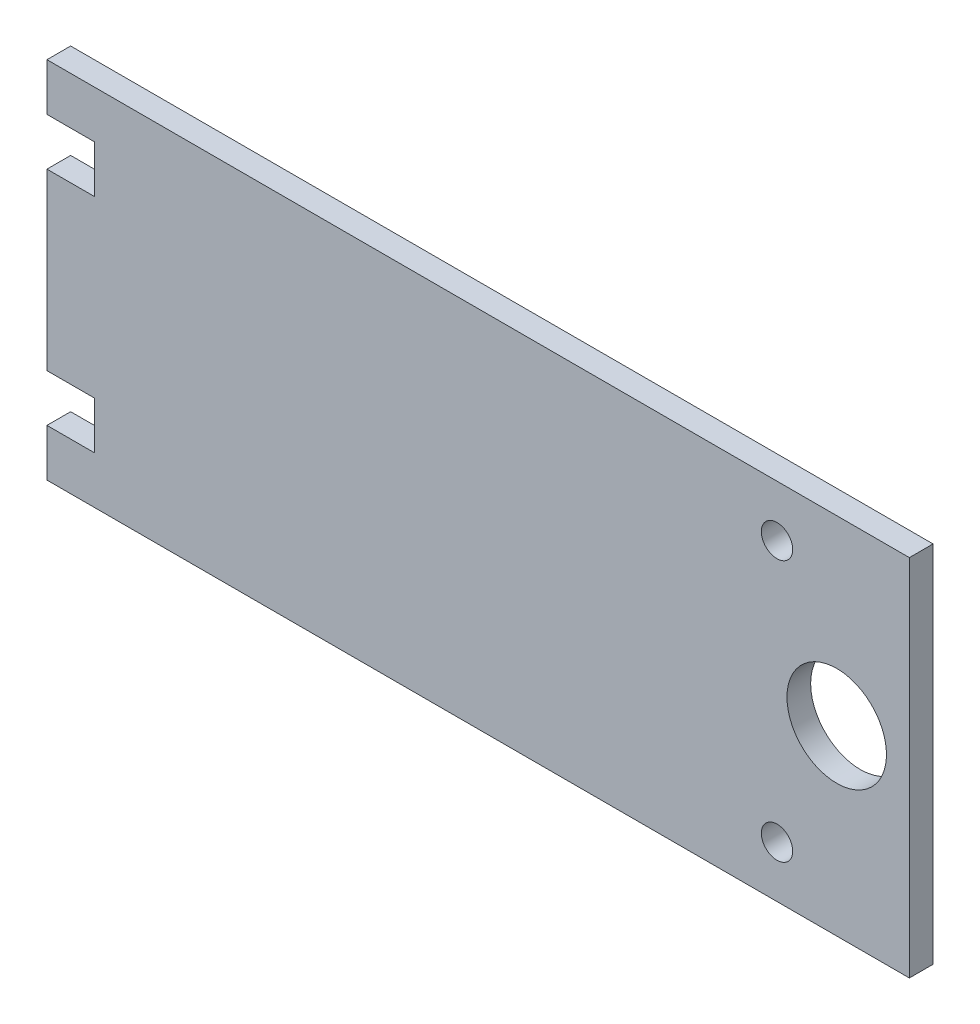
ISO-10303-21;
HEADER;
FILE_DESCRIPTION(('STEP AP214'),'2;1');
FILE_NAME('part.step','',(''),(''),'','','');
FILE_SCHEMA(('AUTOMOTIVE_DESIGN { 1 0 10303 214 1 1 1 1 }'));
ENDSEC;
DATA;
#1=APPLICATION_CONTEXT('core data for automotive mechanical design processes');
#2=APPLICATION_PROTOCOL_DEFINITION('international standard','automotive_design',2000,#1);
#3=PRODUCT_CONTEXT('',#1,'mechanical');
#4=PRODUCT('Part','Part','',(#3));
#5=PRODUCT_RELATED_PRODUCT_CATEGORY('part','',(#4));
#6=PRODUCT_DEFINITION_FORMATION('','',#4);
#7=PRODUCT_DEFINITION_CONTEXT('part definition',#1,'design');
#8=PRODUCT_DEFINITION('design','',#6,#7);
#9=PRODUCT_DEFINITION_SHAPE('','',#8);
#10=(LENGTH_UNIT() NAMED_UNIT(*) SI_UNIT(.MILLI.,.METRE.));
#11=(NAMED_UNIT(*) PLANE_ANGLE_UNIT() SI_UNIT($,.RADIAN.));
#12=(NAMED_UNIT(*) SI_UNIT($,.STERADIAN.) SOLID_ANGLE_UNIT());
#13=UNCERTAINTY_MEASURE_WITH_UNIT(LENGTH_MEASURE(1.E-05),#10,'distance_accuracy_value','');
#14=(GEOMETRIC_REPRESENTATION_CONTEXT(3) GLOBAL_UNCERTAINTY_ASSIGNED_CONTEXT((#13)) GLOBAL_UNIT_ASSIGNED_CONTEXT((#10,
#11,#12)) REPRESENTATION_CONTEXT('',''));
#15=CARTESIAN_POINT('',(0.,0.,0.));
#16=DIRECTION('',(0.,0.,1.));
#17=DIRECTION('',(1.,0.,0.));
#18=AXIS2_PLACEMENT_3D('',#15,#16,#17);
#19=CARTESIAN_POINT('',(-57.785,24.3948339939949,3.175));
#20=DIRECTION('',(1.,0.,0.));
#21=DIRECTION('',(0.,0.,-1.));
#22=AXIS2_PLACEMENT_3D('',#19,#20,#21);
#23=PLANE('',#22);
#24=DIRECTION('',(0.,-1.,0.));
#25=VECTOR('',#24,1.);
#26=CARTESIAN_POINT('',(-57.785,24.3948339939949,0.));
#27=LINE('',#26,#25);
#28=CARTESIAN_POINT('',(-57.785,24.3948339939949,0.));
#29=VERTEX_POINT('',#28);
#30=CARTESIAN_POINT('',(-57.785,18.0448339939949,0.));
#31=VERTEX_POINT('',#30);
#32=EDGE_CURVE('E142',#29,#31,#27,.T.);
#33=ORIENTED_EDGE('',*,*,#32,.T.);
#34=DIRECTION('',(0.,0.,1.));
#35=VECTOR('',#34,1.);
#36=CARTESIAN_POINT('',(-57.785,18.0448339939949,0.));
#37=LINE('',#36,#35);
#38=CARTESIAN_POINT('',(-57.785,18.0448339939949,3.175));
#39=VERTEX_POINT('',#38);
#40=EDGE_CURVE('E127',#31,#39,#37,.T.);
#41=ORIENTED_EDGE('',*,*,#40,.T.);
#42=DIRECTION('',(0.,-1.,0.));
#43=VECTOR('',#42,1.);
#44=CARTESIAN_POINT('',(-57.785,24.3948339939949,3.175));
#45=LINE('',#44,#43);
#46=CARTESIAN_POINT('',(-57.785,24.3948339939949,3.175));
#47=VERTEX_POINT('',#46);
#48=EDGE_CURVE('E174',#47,#39,#45,.T.);
#49=ORIENTED_EDGE('',*,*,#48,.F.);
#50=DIRECTION('',(0.,0.,-1.));
#51=VECTOR('',#50,1.);
#52=CARTESIAN_POINT('',(-57.785,24.3948339939949,3.175));
#53=LINE('',#52,#51);
#54=EDGE_CURVE('E46',#47,#29,#53,.T.);
#55=ORIENTED_EDGE('',*,*,#54,.T.);
#56=EDGE_LOOP('',(#33,#41,#49,#55));
#57=FACE_BOUND('',#56,.T.);
#58=ADVANCED_FACE('F38',(#57),#23,.F.);
#59=CARTESIAN_POINT('',(-57.785,11.6948339939949,3.175));
#60=VERTEX_POINT('',#59);
#61=CARTESIAN_POINT('',(-57.785,-11.6948339939949,3.175));
#62=VERTEX_POINT('',#61);
#63=EDGE_CURVE('E196',#60,#62,#45,.T.);
#64=ORIENTED_EDGE('',*,*,#63,.F.);
#65=DIRECTION('',(0.,0.,1.));
#66=VECTOR('',#65,1.);
#67=CARTESIAN_POINT('',(-57.785,11.6948339939949,0.));
#68=LINE('',#67,#66);
#69=CARTESIAN_POINT('',(-57.785,11.6948339939949,0.));
#70=VERTEX_POINT('',#69);
#71=EDGE_CURVE('E137',#70,#60,#68,.T.);
#72=ORIENTED_EDGE('',*,*,#71,.F.);
#73=CARTESIAN_POINT('',(-57.785,-11.6948339939949,0.));
#74=VERTEX_POINT('',#73);
#75=EDGE_CURVE('E150',#70,#74,#27,.T.);
#76=ORIENTED_EDGE('',*,*,#75,.T.);
#77=DIRECTION('',(0.,0.,1.));
#78=VECTOR('',#77,1.);
#79=CARTESIAN_POINT('',(-57.785,-11.6948339939949,0.));
#80=LINE('',#79,#78);
#81=EDGE_CURVE('E242',#74,#62,#80,.T.);
#82=ORIENTED_EDGE('',*,*,#81,.T.);
#83=EDGE_LOOP('',(#64,#72,#76,#82));
#84=FACE_BOUND('',#83,.T.);
#85=ADVANCED_FACE('F301',(#84),#23,.F.);
#86=CARTESIAN_POINT('',(57.785,24.3948339939949,3.175));
#87=DIRECTION('',(-1.,0.,0.));
#88=DIRECTION('',(0.,0.,1.));
#89=AXIS2_PLACEMENT_3D('',#86,#87,#88);
#90=PLANE('',#89);
#91=DIRECTION('',(0.,1.,0.));
#92=VECTOR('',#91,1.);
#93=CARTESIAN_POINT('',(57.785,24.3948339939949,0.));
#94=LINE('',#93,#92);
#95=CARTESIAN_POINT('',(57.785,-24.3948339939949,0.));
#96=VERTEX_POINT('',#95);
#97=CARTESIAN_POINT('',(57.785,24.3948339939949,0.));
#98=VERTEX_POINT('',#97);
#99=EDGE_CURVE('E163',#96,#98,#94,.T.);
#100=ORIENTED_EDGE('',*,*,#99,.T.);
#101=DIRECTION('',(0.,0.,-1.));
#102=VECTOR('',#101,1.);
#103=CARTESIAN_POINT('',(57.785,24.3948339939949,3.175));
#104=LINE('',#103,#102);
#105=CARTESIAN_POINT('',(57.785,24.3948339939949,3.175));
#106=VERTEX_POINT('',#105);
#107=EDGE_CURVE('E12',#106,#98,#104,.T.);
#108=ORIENTED_EDGE('',*,*,#107,.F.);
#109=DIRECTION('',(0.,1.,0.));
#110=VECTOR('',#109,1.);
#111=CARTESIAN_POINT('',(57.785,24.3948339939949,3.175));
#112=LINE('',#111,#110);
#113=CARTESIAN_POINT('',(57.785,-24.3948339939949,3.175));
#114=VERTEX_POINT('',#113);
#115=EDGE_CURVE('E153',#114,#106,#112,.T.);
#116=ORIENTED_EDGE('',*,*,#115,.F.);
#117=DIRECTION('',(0.,0.,-1.));
#118=VECTOR('',#117,1.);
#119=CARTESIAN_POINT('',(57.785,-24.3948339939949,3.175));
#120=LINE('',#119,#118);
#121=EDGE_CURVE('E173',#114,#96,#120,.T.);
#122=ORIENTED_EDGE('',*,*,#121,.T.);
#123=EDGE_LOOP('',(#100,#108,#116,#122));
#124=FACE_BOUND('',#123,.T.);
#125=ADVANCED_FACE('F40',(#124),#90,.F.);
#126=CARTESIAN_POINT('',(-57.785,24.3948339939949,3.175));
#127=DIRECTION('',(0.,-1.,0.));
#128=DIRECTION('',(0.,0.,-1.));
#129=AXIS2_PLACEMENT_3D('',#126,#127,#128);
#130=PLANE('',#129);
#131=DIRECTION('',(-1.,0.,0.));
#132=VECTOR('',#131,1.);
#133=CARTESIAN_POINT('',(-57.785,24.3948339939949,0.));
#134=LINE('',#133,#132);
#135=EDGE_CURVE('E157',#98,#29,#134,.T.);
#136=ORIENTED_EDGE('',*,*,#135,.T.);
#137=ORIENTED_EDGE('',*,*,#54,.F.);
#138=DIRECTION('',(-1.,0.,0.));
#139=VECTOR('',#138,1.);
#140=CARTESIAN_POINT('',(-57.785,24.3948339939949,3.175));
#141=LINE('',#140,#139);
#142=EDGE_CURVE('E188',#106,#47,#141,.T.);
#143=ORIENTED_EDGE('',*,*,#142,.F.);
#144=ORIENTED_EDGE('',*,*,#107,.T.);
#145=EDGE_LOOP('',(#136,#137,#143,#144));
#146=FACE_BOUND('',#145,.T.);
#147=ADVANCED_FACE('F309',(#146),#130,.F.);
#148=CARTESIAN_POINT('',(-57.785,-18.0448339939949,3.175));
#149=VERTEX_POINT('',#148);
#150=CARTESIAN_POINT('',(-57.785,-24.3948339939949,3.175));
#151=VERTEX_POINT('',#150);
#152=EDGE_CURVE('E192',#149,#151,#45,.T.);
#153=ORIENTED_EDGE('',*,*,#152,.F.);
#154=DIRECTION('',(0.,0.,1.));
#155=VECTOR('',#154,1.);
#156=CARTESIAN_POINT('',(-57.785,-18.0448339939949,0.));
#157=LINE('',#156,#155);
#158=CARTESIAN_POINT('',(-57.785,-18.0448339939949,0.));
#159=VERTEX_POINT('',#158);
#160=EDGE_CURVE('E257',#159,#149,#157,.T.);
#161=ORIENTED_EDGE('',*,*,#160,.F.);
#162=CARTESIAN_POINT('',(-57.785,-24.3948339939949,0.));
#163=VERTEX_POINT('',#162);
#164=EDGE_CURVE('E152',#159,#163,#27,.T.);
#165=ORIENTED_EDGE('',*,*,#164,.T.);
#166=DIRECTION('',(0.,0.,-1.));
#167=VECTOR('',#166,1.);
#168=CARTESIAN_POINT('',(-57.785,-24.3948339939949,3.175));
#169=LINE('',#168,#167);
#170=EDGE_CURVE('E315',#151,#163,#169,.T.);
#171=ORIENTED_EDGE('',*,*,#170,.F.);
#172=EDGE_LOOP('',(#153,#161,#165,#171));
#173=FACE_BOUND('',#172,.T.);
#174=ADVANCED_FACE('F303',(#173),#23,.F.);
#175=CARTESIAN_POINT('',(-57.785,-24.3948339939949,3.175));
#176=DIRECTION('',(0.,1.,0.));
#177=DIRECTION('',(0.,0.,1.));
#178=AXIS2_PLACEMENT_3D('',#175,#176,#177);
#179=PLANE('',#178);
#180=DIRECTION('',(1.,0.,0.));
#181=VECTOR('',#180,1.);
#182=CARTESIAN_POINT('',(-57.785,-24.3948339939949,0.));
#183=LINE('',#182,#181);
#184=EDGE_CURVE('E149',#163,#96,#183,.T.);
#185=ORIENTED_EDGE('',*,*,#184,.T.);
#186=ORIENTED_EDGE('',*,*,#121,.F.);
#187=DIRECTION('',(1.,0.,0.));
#188=VECTOR('',#187,1.);
#189=CARTESIAN_POINT('',(-57.785,-24.3948339939949,3.175));
#190=LINE('',#189,#188);
#191=EDGE_CURVE('E169',#151,#114,#190,.T.);
#192=ORIENTED_EDGE('',*,*,#191,.F.);
#193=ORIENTED_EDGE('',*,*,#170,.T.);
#194=EDGE_LOOP('',(#185,#186,#192,#193));
#195=FACE_BOUND('',#194,.T.);
#196=ADVANCED_FACE('F295',(#195),#179,.F.);
#197=CARTESIAN_POINT('',(0.,0.,3.175));
#198=DIRECTION('',(0.,0.,1.));
#199=DIRECTION('',(1.,0.,0.));
#200=AXIS2_PLACEMENT_3D('',#197,#198,#199);
#201=PLANE('',#200);
#202=DIRECTION('',(-1.,0.,0.));
#203=VECTOR('',#202,1.);
#204=CARTESIAN_POINT('',(-57.785,18.0448339939949,3.175));
#205=LINE('',#204,#203);
#206=CARTESIAN_POINT('',(-51.435,18.0448339939949,3.175));
#207=VERTEX_POINT('',#206);
#208=EDGE_CURVE('E132',#207,#39,#205,.T.);
#209=ORIENTED_EDGE('',*,*,#208,.F.);
#210=DIRECTION('',(0.,1.,0.));
#211=VECTOR('',#210,1.);
#212=CARTESIAN_POINT('',(-51.435,18.0448339939949,3.175));
#213=LINE('',#212,#211);
#214=CARTESIAN_POINT('',(-51.435,11.6948339939949,3.175));
#215=VERTEX_POINT('',#214);
#216=EDGE_CURVE('E145',#215,#207,#213,.T.);
#217=ORIENTED_EDGE('',*,*,#216,.F.);
#218=DIRECTION('',(1.,0.,0.));
#219=VECTOR('',#218,1.);
#220=CARTESIAN_POINT('',(-57.785,11.6948339939949,3.175));
#221=LINE('',#220,#219);
#222=EDGE_CURVE('E209',#60,#215,#221,.T.);
#223=ORIENTED_EDGE('',*,*,#222,.F.);
#224=ORIENTED_EDGE('',*,*,#63,.T.);
#225=DIRECTION('',(-1.,0.,0.));
#226=VECTOR('',#225,1.);
#227=CARTESIAN_POINT('',(-57.785,-11.6948339939949,3.175));
#228=LINE('',#227,#226);
#229=CARTESIAN_POINT('',(-51.435,-11.6948339939949,3.175));
#230=VERTEX_POINT('',#229);
#231=EDGE_CURVE('E243',#230,#62,#228,.T.);
#232=ORIENTED_EDGE('',*,*,#231,.F.);
#233=DIRECTION('',(0.,1.,0.));
#234=VECTOR('',#233,1.);
#235=CARTESIAN_POINT('',(-51.435,-11.6948339939949,3.175));
#236=LINE('',#235,#234);
#237=CARTESIAN_POINT('',(-51.435,-18.0448339939949,3.175));
#238=VERTEX_POINT('',#237);
#239=EDGE_CURVE('E238',#238,#230,#236,.T.);
#240=ORIENTED_EDGE('',*,*,#239,.F.);
#241=DIRECTION('',(1.,0.,0.));
#242=VECTOR('',#241,1.);
#243=CARTESIAN_POINT('',(-57.785,-18.0448339939949,3.175));
#244=LINE('',#243,#242);
#245=EDGE_CURVE('E247',#149,#238,#244,.T.);
#246=ORIENTED_EDGE('',*,*,#245,.F.);
#247=ORIENTED_EDGE('',*,*,#152,.T.);
#248=ORIENTED_EDGE('',*,*,#191,.T.);
#249=ORIENTED_EDGE('',*,*,#115,.T.);
#250=ORIENTED_EDGE('',*,*,#142,.T.);
#251=ORIENTED_EDGE('',*,*,#48,.T.);
#252=EDGE_LOOP('',(#209,#217,#223,#224,#232,#240,#246,#247,#248,#249,#250,#251));
#253=FACE_BOUND('',#252,.T.);
#254=CARTESIAN_POINT('',(40.0489327397611,17.5,3.175));
#255=DIRECTION('',(0.,0.,-1.));
#256=DIRECTION('',(-1.,0.,0.));
#257=AXIS2_PLACEMENT_3D('',#254,#255,#256);
#258=CIRCLE('',#257,2.10185);
#259=CARTESIAN_POINT('',(37.9470827397611,17.5,3.175));
#260=VERTEX_POINT('',#259);
#261=EDGE_CURVE('E166',#260,#260,#258,.T.);
#262=ORIENTED_EDGE('',*,*,#261,.T.);
#263=EDGE_LOOP('',(#262));
#264=FACE_BOUND('',#263,.T.);
#265=CARTESIAN_POINT('',(40.0489327397609,-17.5,3.175));
#266=DIRECTION('',(0.,0.,-1.));
#267=DIRECTION('',(-1.,0.,0.));
#268=AXIS2_PLACEMENT_3D('',#265,#266,#267);
#269=CIRCLE('',#268,2.10185);
#270=CARTESIAN_POINT('',(37.9470827397609,-17.5,3.175));
#271=VERTEX_POINT('',#270);
#272=EDGE_CURVE('E267',#271,#271,#269,.T.);
#273=ORIENTED_EDGE('',*,*,#272,.T.);
#274=EDGE_LOOP('',(#273));
#275=FACE_BOUND('',#274,.T.);
#276=CARTESIAN_POINT('',(48.048932739761,0.,3.175));
#277=DIRECTION('',(0.,0.,-1.));
#278=DIRECTION('',(-1.,0.,0.));
#279=AXIS2_PLACEMENT_3D('',#276,#277,#278);
#280=CIRCLE('',#279,6.6675);
#281=CARTESIAN_POINT('',(41.381432739761,0.,3.175));
#282=VERTEX_POINT('',#281);
#283=EDGE_CURVE('E274',#282,#282,#280,.T.);
#284=ORIENTED_EDGE('',*,*,#283,.T.);
#285=EDGE_LOOP('',(#284));
#286=FACE_BOUND('',#285,.T.);
#287=ADVANCED_FACE('F203',(#253,#264,#275,#286),#201,.T.);
#288=CARTESIAN_POINT('',(0.,0.,0.));
#289=DIRECTION('',(0.,0.,1.));
#290=DIRECTION('',(1.,0.,0.));
#291=AXIS2_PLACEMENT_3D('',#288,#289,#290);
#292=PLANE('',#291);
#293=CARTESIAN_POINT('',(40.0489327397611,17.5,0.));
#294=DIRECTION('',(0.,0.,-1.));
#295=DIRECTION('',(-1.,0.,0.));
#296=AXIS2_PLACEMENT_3D('',#293,#294,#295);
#297=CIRCLE('',#296,2.10185);
#298=CARTESIAN_POINT('',(37.9470827397611,17.5,0.));
#299=VERTEX_POINT('',#298);
#300=EDGE_CURVE('E264',#299,#299,#297,.T.);
#301=ORIENTED_EDGE('',*,*,#300,.F.);
#302=EDGE_LOOP('',(#301));
#303=FACE_BOUND('',#302,.T.);
#304=CARTESIAN_POINT('',(40.0489327397609,-17.5,0.));
#305=DIRECTION('',(0.,0.,-1.));
#306=DIRECTION('',(-1.,0.,0.));
#307=AXIS2_PLACEMENT_3D('',#304,#305,#306);
#308=CIRCLE('',#307,2.10185);
#309=CARTESIAN_POINT('',(37.9470827397609,-17.5,0.));
#310=VERTEX_POINT('',#309);
#311=EDGE_CURVE('E272',#310,#310,#308,.T.);
#312=ORIENTED_EDGE('',*,*,#311,.F.);
#313=EDGE_LOOP('',(#312));
#314=FACE_BOUND('',#313,.T.);
#315=CARTESIAN_POINT('',(48.048932739761,0.,0.));
#316=DIRECTION('',(0.,0.,-1.));
#317=DIRECTION('',(-1.,0.,0.));
#318=AXIS2_PLACEMENT_3D('',#315,#316,#317);
#319=CIRCLE('',#318,6.6675);
#320=CARTESIAN_POINT('',(41.381432739761,0.,0.));
#321=VERTEX_POINT('',#320);
#322=EDGE_CURVE('E189',#321,#321,#319,.T.);
#323=ORIENTED_EDGE('',*,*,#322,.F.);
#324=EDGE_LOOP('',(#323));
#325=FACE_BOUND('',#324,.T.);
#326=DIRECTION('',(0.,1.,0.));
#327=VECTOR('',#326,1.);
#328=CARTESIAN_POINT('',(-51.435,18.0448339939949,0.));
#329=LINE('',#328,#327);
#330=CARTESIAN_POINT('',(-51.435,11.6948339939949,0.));
#331=VERTEX_POINT('',#330);
#332=CARTESIAN_POINT('',(-51.435,18.0448339939949,0.));
#333=VERTEX_POINT('',#332);
#334=EDGE_CURVE('E53',#331,#333,#329,.T.);
#335=ORIENTED_EDGE('',*,*,#334,.T.);
#336=DIRECTION('',(-1.,0.,0.));
#337=VECTOR('',#336,1.);
#338=CARTESIAN_POINT('',(-57.785,18.0448339939949,0.));
#339=LINE('',#338,#337);
#340=EDGE_CURVE('E130',#333,#31,#339,.T.);
#341=ORIENTED_EDGE('',*,*,#340,.T.);
#342=ORIENTED_EDGE('',*,*,#32,.F.);
#343=ORIENTED_EDGE('',*,*,#135,.F.);
#344=ORIENTED_EDGE('',*,*,#99,.F.);
#345=ORIENTED_EDGE('',*,*,#184,.F.);
#346=ORIENTED_EDGE('',*,*,#164,.F.);
#347=DIRECTION('',(1.,0.,0.));
#348=VECTOR('',#347,1.);
#349=CARTESIAN_POINT('',(-57.785,-18.0448339939949,0.));
#350=LINE('',#349,#348);
#351=CARTESIAN_POINT('',(-51.435,-18.0448339939949,0.));
#352=VERTEX_POINT('',#351);
#353=EDGE_CURVE('E237',#159,#352,#350,.T.);
#354=ORIENTED_EDGE('',*,*,#353,.T.);
#355=DIRECTION('',(0.,1.,0.));
#356=VECTOR('',#355,1.);
#357=CARTESIAN_POINT('',(-51.435,-11.6948339939949,0.));
#358=LINE('',#357,#356);
#359=CARTESIAN_POINT('',(-51.435,-11.6948339939949,0.));
#360=VERTEX_POINT('',#359);
#361=EDGE_CURVE('E61',#352,#360,#358,.T.);
#362=ORIENTED_EDGE('',*,*,#361,.T.);
#363=DIRECTION('',(-1.,0.,0.));
#364=VECTOR('',#363,1.);
#365=CARTESIAN_POINT('',(-57.785,-11.6948339939949,0.));
#366=LINE('',#365,#364);
#367=EDGE_CURVE('E234',#360,#74,#366,.T.);
#368=ORIENTED_EDGE('',*,*,#367,.T.);
#369=ORIENTED_EDGE('',*,*,#75,.F.);
#370=DIRECTION('',(1.,0.,0.));
#371=VECTOR('',#370,1.);
#372=CARTESIAN_POINT('',(-57.785,11.6948339939949,0.));
#373=LINE('',#372,#371);
#374=EDGE_CURVE('E144',#70,#331,#373,.T.);
#375=ORIENTED_EDGE('',*,*,#374,.T.);
#376=EDGE_LOOP('',(#335,#341,#342,#343,#344,#345,#346,#354,#362,#368,#369,#375));
#377=FACE_BOUND('',#376,.T.);
#378=ADVANCED_FACE('F141',(#303,#314,#325,#377),#292,.F.);
#379=CARTESIAN_POINT('',(48.048932739761,0.,3.175));
#380=DIRECTION('',(0.,0.,-1.));
#381=DIRECTION('',(-1.,0.,0.));
#382=AXIS2_PLACEMENT_3D('',#379,#380,#381);
#383=CYLINDRICAL_SURFACE('',#382,6.6675);
#384=ORIENTED_EDGE('',*,*,#283,.F.);
#385=EDGE_LOOP('',(#384));
#386=FACE_BOUND('',#385,.T.);
#387=ORIENTED_EDGE('',*,*,#322,.T.);
#388=EDGE_LOOP('',(#387));
#389=FACE_BOUND('',#388,.T.);
#390=ADVANCED_FACE('F283',(#386,#389),#383,.F.);
#391=CARTESIAN_POINT('',(40.0489327397609,-17.5,3.175));
#392=DIRECTION('',(0.,0.,-1.));
#393=DIRECTION('',(-1.,0.,0.));
#394=AXIS2_PLACEMENT_3D('',#391,#392,#393);
#395=CYLINDRICAL_SURFACE('',#394,2.10185);
#396=ORIENTED_EDGE('',*,*,#272,.F.);
#397=EDGE_LOOP('',(#396));
#398=FACE_BOUND('',#397,.T.);
#399=ORIENTED_EDGE('',*,*,#311,.T.);
#400=EDGE_LOOP('',(#399));
#401=FACE_BOUND('',#400,.T.);
#402=ADVANCED_FACE('F292',(#398,#401),#395,.F.);
#403=CARTESIAN_POINT('',(40.0489327397611,17.5,3.175));
#404=DIRECTION('',(0.,0.,-1.));
#405=DIRECTION('',(-1.,0.,0.));
#406=AXIS2_PLACEMENT_3D('',#403,#404,#405);
#407=CYLINDRICAL_SURFACE('',#406,2.10185);
#408=ORIENTED_EDGE('',*,*,#261,.F.);
#409=EDGE_LOOP('',(#408));
#410=FACE_BOUND('',#409,.T.);
#411=ORIENTED_EDGE('',*,*,#300,.T.);
#412=EDGE_LOOP('',(#411));
#413=FACE_BOUND('',#412,.T.);
#414=ADVANCED_FACE('F356',(#410,#413),#407,.F.);
#415=CARTESIAN_POINT('',(-57.785,-11.6948339939949,0.));
#416=DIRECTION('',(0.,1.,0.));
#417=DIRECTION('',(-1.,0.,0.));
#418=AXIS2_PLACEMENT_3D('',#415,#416,#417);
#419=PLANE('',#418);
#420=ORIENTED_EDGE('',*,*,#231,.T.);
#421=ORIENTED_EDGE('',*,*,#81,.F.);
#422=ORIENTED_EDGE('',*,*,#367,.F.);
#423=DIRECTION('',(0.,0.,1.));
#424=VECTOR('',#423,1.);
#425=CARTESIAN_POINT('',(-51.435,-11.6948339939949,0.));
#426=LINE('',#425,#424);
#427=EDGE_CURVE('E210',#360,#230,#426,.T.);
#428=ORIENTED_EDGE('',*,*,#427,.T.);
#429=EDGE_LOOP('',(#420,#421,#422,#428));
#430=FACE_BOUND('',#429,.T.);
#431=ADVANCED_FACE('F335',(#430),#419,.F.);
#432=CARTESIAN_POINT('',(-51.435,-11.6948339939949,0.));
#433=DIRECTION('',(1.,0.,0.));
#434=DIRECTION('',(0.,0.,-1.));
#435=AXIS2_PLACEMENT_3D('',#432,#433,#434);
#436=PLANE('',#435);
#437=ORIENTED_EDGE('',*,*,#239,.T.);
#438=ORIENTED_EDGE('',*,*,#427,.F.);
#439=ORIENTED_EDGE('',*,*,#361,.F.);
#440=DIRECTION('',(0.,0.,1.));
#441=VECTOR('',#440,1.);
#442=CARTESIAN_POINT('',(-51.435,-18.0448339939949,0.));
#443=LINE('',#442,#441);
#444=EDGE_CURVE('E216',#352,#238,#443,.T.);
#445=ORIENTED_EDGE('',*,*,#444,.T.);
#446=EDGE_LOOP('',(#437,#438,#439,#445));
#447=FACE_BOUND('',#446,.T.);
#448=ADVANCED_FACE('F330',(#447),#436,.F.);
#449=CARTESIAN_POINT('',(-57.785,-18.0448339939949,0.));
#450=DIRECTION('',(0.,-1.,0.));
#451=DIRECTION('',(1.,0.,0.));
#452=AXIS2_PLACEMENT_3D('',#449,#450,#451);
#453=PLANE('',#452);
#454=ORIENTED_EDGE('',*,*,#245,.T.);
#455=ORIENTED_EDGE('',*,*,#444,.F.);
#456=ORIENTED_EDGE('',*,*,#353,.F.);
#457=ORIENTED_EDGE('',*,*,#160,.T.);
#458=EDGE_LOOP('',(#454,#455,#456,#457));
#459=FACE_BOUND('',#458,.T.);
#460=ADVANCED_FACE('F328',(#459),#453,.F.);
#461=CARTESIAN_POINT('',(-57.785,18.0448339939949,0.));
#462=DIRECTION('',(0.,1.,0.));
#463=DIRECTION('',(0.,0.,1.));
#464=AXIS2_PLACEMENT_3D('',#461,#462,#463);
#465=PLANE('',#464);
#466=ORIENTED_EDGE('',*,*,#208,.T.);
#467=ORIENTED_EDGE('',*,*,#40,.F.);
#468=ORIENTED_EDGE('',*,*,#340,.F.);
#469=DIRECTION('',(0.,0.,1.));
#470=VECTOR('',#469,1.);
#471=CARTESIAN_POINT('',(-51.435,18.0448339939949,0.));
#472=LINE('',#471,#470);
#473=EDGE_CURVE('E229',#333,#207,#472,.T.);
#474=ORIENTED_EDGE('',*,*,#473,.T.);
#475=EDGE_LOOP('',(#466,#467,#468,#474));
#476=FACE_BOUND('',#475,.T.);
#477=ADVANCED_FACE('F129',(#476),#465,.F.);
#478=CARTESIAN_POINT('',(-51.435,18.0448339939949,0.));
#479=DIRECTION('',(1.,0.,0.));
#480=DIRECTION('',(0.,1.,0.));
#481=AXIS2_PLACEMENT_3D('',#478,#479,#480);
#482=PLANE('',#481);
#483=ORIENTED_EDGE('',*,*,#216,.T.);
#484=ORIENTED_EDGE('',*,*,#473,.F.);
#485=ORIENTED_EDGE('',*,*,#334,.F.);
#486=DIRECTION('',(0.,0.,1.));
#487=VECTOR('',#486,1.);
#488=CARTESIAN_POINT('',(-51.435,11.6948339939949,0.));
#489=LINE('',#488,#487);
#490=EDGE_CURVE('E231',#331,#215,#489,.T.);
#491=ORIENTED_EDGE('',*,*,#490,.T.);
#492=EDGE_LOOP('',(#483,#484,#485,#491));
#493=FACE_BOUND('',#492,.T.);
#494=ADVANCED_FACE('F340',(#493),#482,.F.);
#495=CARTESIAN_POINT('',(-57.785,11.6948339939949,0.));
#496=DIRECTION('',(0.,-1.,0.));
#497=DIRECTION('',(1.,0.,0.));
#498=AXIS2_PLACEMENT_3D('',#495,#496,#497);
#499=PLANE('',#498);
#500=ORIENTED_EDGE('',*,*,#222,.T.);
#501=ORIENTED_EDGE('',*,*,#490,.F.);
#502=ORIENTED_EDGE('',*,*,#374,.F.);
#503=ORIENTED_EDGE('',*,*,#71,.T.);
#504=EDGE_LOOP('',(#500,#501,#502,#503));
#505=FACE_BOUND('',#504,.T.);
#506=ADVANCED_FACE('F339',(#505),#499,.F.);
#507=CLOSED_SHELL('',(#58,#85,#125,#147,#174,#196,#287,#378,#390,#402,#414,#431,#448,#460,#477,
#494,#506));
#508=MANIFOLD_SOLID_BREP('B2',#507);
#509=ADVANCED_BREP_SHAPE_REPRESENTATION('',(#18,#508),#14);
#510=SHAPE_DEFINITION_REPRESENTATION(#9,#509);
ENDSEC;
END-ISO-10303-21;
